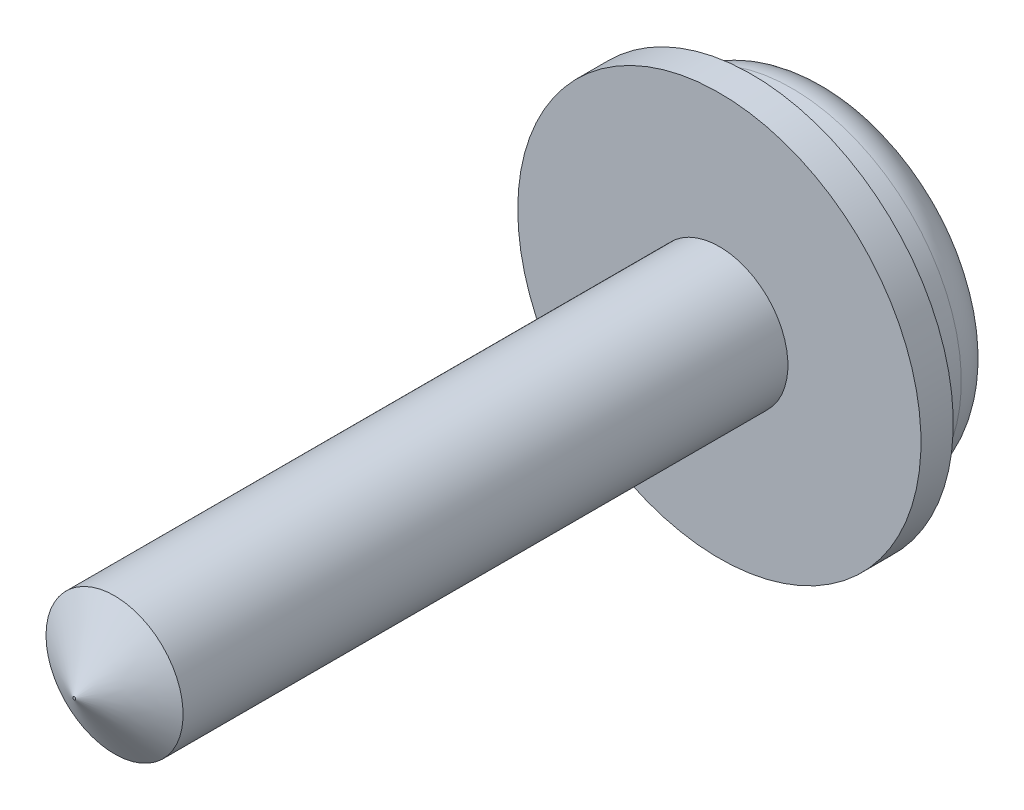
ISO-10303-21;
HEADER;
FILE_DESCRIPTION(('STEP AP214'),'2;1');
FILE_NAME('part.step','',(''),(''),'','','');
FILE_SCHEMA(('AUTOMOTIVE_DESIGN { 1 0 10303 214 1 1 1 1 }'));
ENDSEC;
DATA;
#1=APPLICATION_CONTEXT('core data for automotive mechanical design processes');
#2=APPLICATION_PROTOCOL_DEFINITION('international standard','automotive_design',2000,#1);
#3=PRODUCT_CONTEXT('',#1,'mechanical');
#4=PRODUCT('Part','Part','',(#3));
#5=PRODUCT_RELATED_PRODUCT_CATEGORY('part','',(#4));
#6=PRODUCT_DEFINITION_FORMATION('','',#4);
#7=PRODUCT_DEFINITION_CONTEXT('part definition',#1,'design');
#8=PRODUCT_DEFINITION('design','',#6,#7);
#9=PRODUCT_DEFINITION_SHAPE('','',#8);
#10=(LENGTH_UNIT() NAMED_UNIT(*) SI_UNIT(.MILLI.,.METRE.));
#11=(NAMED_UNIT(*) PLANE_ANGLE_UNIT() SI_UNIT($,.RADIAN.));
#12=(NAMED_UNIT(*) SI_UNIT($,.STERADIAN.) SOLID_ANGLE_UNIT());
#13=UNCERTAINTY_MEASURE_WITH_UNIT(LENGTH_MEASURE(1.E-05),#10,'distance_accuracy_value','');
#14=(GEOMETRIC_REPRESENTATION_CONTEXT(3) GLOBAL_UNCERTAINTY_ASSIGNED_CONTEXT((#13)) GLOBAL_UNIT_ASSIGNED_CONTEXT((#10,
#11,#12)) REPRESENTATION_CONTEXT('',''));
#15=CARTESIAN_POINT('',(0.,0.,0.));
#16=DIRECTION('',(0.,0.,1.));
#17=DIRECTION('',(1.,0.,0.));
#18=AXIS2_PLACEMENT_3D('',#15,#16,#17);
#19=CARTESIAN_POINT('',(0.,0.,-1.4));
#20=DIRECTION('',(0.,0.,-1.));
#21=DIRECTION('',(-1.,0.,0.));
#22=AXIS2_PLACEMENT_3D('',#19,#20,#21);
#23=PLANE('',#22);
#24=CARTESIAN_POINT('',(0.,0.,-1.4));
#25=DIRECTION('',(0.,0.,-1.));
#26=DIRECTION('',(-1.,0.,0.));
#27=AXIS2_PLACEMENT_3D('',#24,#25,#26);
#28=CIRCLE('',#27,1.6);
#29=CARTESIAN_POINT('',(-1.6,0.,-1.4));
#30=VERTEX_POINT('',#29);
#31=EDGE_CURVE('E43',#30,#30,#28,.T.);
#32=ORIENTED_EDGE('',*,*,#31,.T.);
#33=EDGE_LOOP('',(#32));
#34=FACE_BOUND('',#33,.T.);
#35=DIRECTION('',(0.,-1.,0.));
#36=VECTOR('',#35,1.);
#37=CARTESIAN_POINT('',(0.3,0.600000000000002,-1.4));
#38=LINE('',#37,#36);
#39=CARTESIAN_POINT('',(0.3,1.15,-1.4));
#40=VERTEX_POINT('',#39);
#41=CARTESIAN_POINT('',(0.3,0.6,-1.4));
#42=VERTEX_POINT('',#41);
#43=EDGE_CURVE('E50',#40,#42,#38,.T.);
#44=ORIENTED_EDGE('',*,*,#43,.F.);
#45=DIRECTION('',(1.,0.,0.));
#46=VECTOR('',#45,1.);
#47=CARTESIAN_POINT('',(-0.3,1.15,-1.4));
#48=LINE('',#47,#46);
#49=CARTESIAN_POINT('',(-0.3,1.15,-1.4));
#50=VERTEX_POINT('',#49);
#51=EDGE_CURVE('E223',#50,#40,#48,.T.);
#52=ORIENTED_EDGE('',*,*,#51,.F.);
#53=DIRECTION('',(0.,1.,0.));
#54=VECTOR('',#53,1.);
#55=CARTESIAN_POINT('',(-0.3,0.600000000000002,-1.4));
#56=LINE('',#55,#54);
#57=CARTESIAN_POINT('',(-0.3,0.600000000000002,-1.4));
#58=VERTEX_POINT('',#57);
#59=EDGE_CURVE('E221',#58,#50,#56,.T.);
#60=ORIENTED_EDGE('',*,*,#59,.F.);
#61=CARTESIAN_POINT('',(-0.6,0.6,-1.4));
#62=DIRECTION('',(0.,0.,1.));
#63=DIRECTION('',(-1.,0.,0.));
#64=AXIS2_PLACEMENT_3D('',#61,#62,#63);
#65=CIRCLE('',#64,0.3);
#66=CARTESIAN_POINT('',(-0.600000000000002,0.3,-1.4));
#67=VERTEX_POINT('',#66);
#68=EDGE_CURVE('E158',#67,#58,#65,.T.);
#69=ORIENTED_EDGE('',*,*,#68,.F.);
#70=DIRECTION('',(1.,0.,0.));
#71=VECTOR('',#70,1.);
#72=CARTESIAN_POINT('',(-1.15,0.3,-1.4));
#73=LINE('',#72,#71);
#74=CARTESIAN_POINT('',(-1.15,0.3,-1.4));
#75=VERTEX_POINT('',#74);
#76=EDGE_CURVE('E217',#75,#67,#73,.T.);
#77=ORIENTED_EDGE('',*,*,#76,.F.);
#78=DIRECTION('',(0.,1.,0.));
#79=VECTOR('',#78,1.);
#80=CARTESIAN_POINT('',(-1.15,-0.3,-1.4));
#81=LINE('',#80,#79);
#82=CARTESIAN_POINT('',(-1.15,-0.3,-1.4));
#83=VERTEX_POINT('',#82);
#84=EDGE_CURVE('E214',#83,#75,#81,.T.);
#85=ORIENTED_EDGE('',*,*,#84,.F.);
#86=DIRECTION('',(-1.,0.,0.));
#87=VECTOR('',#86,1.);
#88=CARTESIAN_POINT('',(-1.15,-0.3,-1.4));
#89=LINE('',#88,#87);
#90=CARTESIAN_POINT('',(-0.600000000000002,-0.3,-1.4));
#91=VERTEX_POINT('',#90);
#92=EDGE_CURVE('E211',#91,#83,#89,.T.);
#93=ORIENTED_EDGE('',*,*,#92,.F.);
#94=CARTESIAN_POINT('',(-0.6,-0.6,-1.4));
#95=DIRECTION('',(0.,0.,1.));
#96=DIRECTION('',(1.,0.,0.));
#97=AXIS2_PLACEMENT_3D('',#94,#95,#96);
#98=CIRCLE('',#97,0.3);
#99=CARTESIAN_POINT('',(-0.3,-0.600000000000002,-1.4));
#100=VERTEX_POINT('',#99);
#101=EDGE_CURVE('E208',#100,#91,#98,.T.);
#102=ORIENTED_EDGE('',*,*,#101,.F.);
#103=DIRECTION('',(0.,1.,0.));
#104=VECTOR('',#103,1.);
#105=CARTESIAN_POINT('',(-0.3,-1.15,-1.4));
#106=LINE('',#105,#104);
#107=CARTESIAN_POINT('',(-0.3,-1.15,-1.4));
#108=VERTEX_POINT('',#107);
#109=EDGE_CURVE('E205',#108,#100,#106,.T.);
#110=ORIENTED_EDGE('',*,*,#109,.F.);
#111=DIRECTION('',(-1.,0.,0.));
#112=VECTOR('',#111,1.);
#113=CARTESIAN_POINT('',(-0.3,-1.15,-1.4));
#114=LINE('',#113,#112);
#115=CARTESIAN_POINT('',(0.3,-1.15,-1.4));
#116=VERTEX_POINT('',#115);
#117=EDGE_CURVE('E202',#116,#108,#114,.T.);
#118=ORIENTED_EDGE('',*,*,#117,.F.);
#119=DIRECTION('',(0.,-1.,0.));
#120=VECTOR('',#119,1.);
#121=CARTESIAN_POINT('',(0.3,-1.15,-1.4));
#122=LINE('',#121,#120);
#123=CARTESIAN_POINT('',(0.3,-0.600000000000002,-1.4));
#124=VERTEX_POINT('',#123);
#125=EDGE_CURVE('E199',#124,#116,#122,.T.);
#126=ORIENTED_EDGE('',*,*,#125,.F.);
#127=CARTESIAN_POINT('',(0.6,-0.6,-1.4));
#128=DIRECTION('',(0.,0.,1.));
#129=DIRECTION('',(1.,0.,0.));
#130=AXIS2_PLACEMENT_3D('',#127,#128,#129);
#131=CIRCLE('',#130,0.3);
#132=CARTESIAN_POINT('',(0.600000000000002,-0.3,-1.4));
#133=VERTEX_POINT('',#132);
#134=EDGE_CURVE('E196',#133,#124,#131,.T.);
#135=ORIENTED_EDGE('',*,*,#134,.F.);
#136=DIRECTION('',(-1.,0.,0.));
#137=VECTOR('',#136,1.);
#138=CARTESIAN_POINT('',(0.600000000000002,-0.3,-1.4));
#139=LINE('',#138,#137);
#140=CARTESIAN_POINT('',(1.15,-0.3,-1.4));
#141=VERTEX_POINT('',#140);
#142=EDGE_CURVE('E193',#141,#133,#139,.T.);
#143=ORIENTED_EDGE('',*,*,#142,.F.);
#144=DIRECTION('',(0.,-1.,0.));
#145=VECTOR('',#144,1.);
#146=CARTESIAN_POINT('',(1.15,-0.3,-1.4));
#147=LINE('',#146,#145);
#148=CARTESIAN_POINT('',(1.15,0.3,-1.4));
#149=VERTEX_POINT('',#148);
#150=EDGE_CURVE('E190',#149,#141,#147,.T.);
#151=ORIENTED_EDGE('',*,*,#150,.F.);
#152=DIRECTION('',(1.,0.,0.));
#153=VECTOR('',#152,1.);
#154=CARTESIAN_POINT('',(0.600000000000002,0.3,-1.4));
#155=LINE('',#154,#153);
#156=CARTESIAN_POINT('',(0.600000000000002,0.3,-1.4));
#157=VERTEX_POINT('',#156);
#158=EDGE_CURVE('E187',#157,#149,#155,.T.);
#159=ORIENTED_EDGE('',*,*,#158,.F.);
#160=CARTESIAN_POINT('',(0.6,0.6,-1.4));
#161=DIRECTION('',(0.,0.,1.));
#162=DIRECTION('',(-1.,0.,0.));
#163=AXIS2_PLACEMENT_3D('',#160,#161,#162);
#164=CIRCLE('',#163,0.3);
#165=EDGE_CURVE('E184',#42,#157,#164,.T.);
#166=ORIENTED_EDGE('',*,*,#165,.F.);
#167=EDGE_LOOP('',(#44,#52,#60,#69,#77,#85,#93,#102,#110,#118,#126,#135,#143,#151,#159,#166));
#168=FACE_BOUND('',#167,.T.);
#169=ADVANCED_FACE('F35',(#34,#168),#23,.T.);
#170=CARTESIAN_POINT('',(0.,0.,8.));
#171=DIRECTION('',(0.,0.,-1.));
#172=DIRECTION('',(-1.,0.,0.));
#173=AXIS2_PLACEMENT_3D('',#170,#171,#172);
#174=CYLINDRICAL_SURFACE('',#173,0.85);
#175=CARTESIAN_POINT('',(0.,0.,7.5));
#176=DIRECTION('',(0.,0.,1.));
#177=DIRECTION('',(1.,0.,0.));
#178=AXIS2_PLACEMENT_3D('',#175,#176,#177);
#179=CIRCLE('',#178,0.85);
#180=CARTESIAN_POINT('',(-0.850000000000001,0.,7.5));
#181=VERTEX_POINT('',#180);
#182=EDGE_CURVE('E267',#181,#181,#179,.F.);
#183=ORIENTED_EDGE('',*,*,#182,.T.);
#184=EDGE_LOOP('',(#183));
#185=FACE_BOUND('',#184,.T.);
#186=CARTESIAN_POINT('',(0.,0.,0.));
#187=DIRECTION('',(0.,0.,-1.));
#188=DIRECTION('',(-1.,0.,0.));
#189=AXIS2_PLACEMENT_3D('',#186,#187,#188);
#190=CIRCLE('',#189,0.85);
#191=CARTESIAN_POINT('',(-0.85,0.,0.));
#192=VERTEX_POINT('',#191);
#193=EDGE_CURVE('E259',#192,#192,#190,.T.);
#194=ORIENTED_EDGE('',*,*,#193,.F.);
#195=EDGE_LOOP('',(#194));
#196=FACE_BOUND('',#195,.T.);
#197=ADVANCED_FACE('F289',(#185,#196),#174,.T.);
#198=CARTESIAN_POINT('',(0.,0.,8.));
#199=DIRECTION('',(0.,0.,1.));
#200=DIRECTION('',(1.,0.,0.));
#201=AXIS2_PLACEMENT_3D('',#198,#199,#200);
#202=PLANE('',#201);
#203=CARTESIAN_POINT('',(0.,0.,8.));
#204=DIRECTION('',(0.,0.,1.));
#205=DIRECTION('',(1.,0.,0.));
#206=AXIS2_PLACEMENT_3D('',#203,#204,#205);
#207=CIRCLE('',#206,0.0178602588247409);
#208=CARTESIAN_POINT('',(-0.0178602588247423,0.,8.));
#209=VERTEX_POINT('',#208);
#210=EDGE_CURVE('E264',#209,#209,#207,.T.);
#211=ORIENTED_EDGE('',*,*,#210,.T.);
#212=EDGE_LOOP('',(#211));
#213=FACE_BOUND('',#212,.T.);
#214=ADVANCED_FACE('F294',(#213),#202,.T.);
#215=CARTESIAN_POINT('',(0.,0.,8.));
#216=DIRECTION('',(0.,0.,-1.));
#217=DIRECTION('',(-1.,0.,0.));
#218=AXIS2_PLACEMENT_3D('',#215,#216,#217);
#219=CONICAL_SURFACE('',#218,0.0178602588247409,1.02974425867665);
#220=CARTESIAN_POINT('',(-0.850000000000001,0.,7.5));
#221=CARTESIAN_POINT('',(-0.841331877696092,0.,7.50520833333333));
#222=CARTESIAN_POINT('',(-0.832663755392183,0.,7.51041666666666));
#223=CARTESIAN_POINT('',(-0.815327510784365,0.,7.52083333333333));
#224=CARTESIAN_POINT('',(-0.806659388480456,0.,7.52604166666666));
#225=CARTESIAN_POINT('',(-0.789323143872638,0.,7.53645833333333));
#226=CARTESIAN_POINT('',(-0.780655021568729,0.,7.54166666666666));
#227=CARTESIAN_POINT('',(-0.763318776960911,0.,7.55208333333333));
#228=CARTESIAN_POINT('',(-0.754650654657002,0.,7.55729166666666));
#229=CARTESIAN_POINT('',(-0.737314410049185,0.,7.56770833333333));
#230=CARTESIAN_POINT('',(-0.728646287745276,0.,7.57291666666666));
#231=CARTESIAN_POINT('',(-0.711310043137458,0.,7.58333333333333));
#232=CARTESIAN_POINT('',(-0.702641920833549,0.,7.58854166666666));
#233=CARTESIAN_POINT('',(-0.685305676225731,0.,7.59895833333333));
#234=CARTESIAN_POINT('',(-0.676637553921822,0.,7.60416666666666));
#235=CARTESIAN_POINT('',(-0.659301309314004,0.,7.61458333333333));
#236=CARTESIAN_POINT('',(-0.650633187010095,0.,7.61979166666666));
#237=CARTESIAN_POINT('',(-0.633296942402277,0.,7.63020833333333));
#238=CARTESIAN_POINT('',(-0.624628820098368,0.,7.63541666666666));
#239=CARTESIAN_POINT('',(-0.60729257549055,0.,7.64583333333333));
#240=CARTESIAN_POINT('',(-0.598624453186641,0.,7.65104166666666));
#241=CARTESIAN_POINT('',(-0.581288208578824,0.,7.66145833333333));
#242=CARTESIAN_POINT('',(-0.572620086274915,0.,7.66666666666666));
#243=CARTESIAN_POINT('',(-0.555283841667097,0.,7.67708333333333));
#244=CARTESIAN_POINT('',(-0.546615719363188,0.,7.68229166666666));
#245=CARTESIAN_POINT('',(-0.52927947475537,0.,7.69270833333333));
#246=CARTESIAN_POINT('',(-0.520611352451461,0.,7.69791666666666));
#247=CARTESIAN_POINT('',(-0.503275107843643,0.,7.70833333333333));
#248=CARTESIAN_POINT('',(-0.494606985539734,0.,7.71354166666666));
#249=CARTESIAN_POINT('',(-0.477270740931916,0.,7.72395833333333));
#250=CARTESIAN_POINT('',(-0.468602618628007,0.,7.72916666666666));
#251=CARTESIAN_POINT('',(-0.451266374020189,0.,7.73958333333333));
#252=CARTESIAN_POINT('',(-0.442598251716281,0.,7.74479166666666));
#253=CARTESIAN_POINT('',(-0.425262007108463,0.,7.75520833333333));
#254=CARTESIAN_POINT('',(-0.416593884804554,0.,7.76041666666666));
#255=CARTESIAN_POINT('',(-0.399257640196736,0.,7.77083333333333));
#256=CARTESIAN_POINT('',(-0.390589517892827,0.,7.77604166666666));
#257=CARTESIAN_POINT('',(-0.373253273285009,0.,7.78645833333333));
#258=CARTESIAN_POINT('',(-0.3645851509811,0.,7.79166666666666));
#259=CARTESIAN_POINT('',(-0.347248906373282,0.,7.80208333333333));
#260=CARTESIAN_POINT('',(-0.338580784069373,0.,7.80729166666666));
#261=CARTESIAN_POINT('',(-0.321244539461555,0.,7.81770833333333));
#262=CARTESIAN_POINT('',(-0.312576417157646,0.,7.82291666666667));
#263=CARTESIAN_POINT('',(-0.295240172549829,0.,7.83333333333333));
#264=CARTESIAN_POINT('',(-0.28657205024592,0.,7.83854166666667));
#265=CARTESIAN_POINT('',(-0.269235805638102,0.,7.84895833333333));
#266=CARTESIAN_POINT('',(-0.260567683334193,0.,7.85416666666667));
#267=CARTESIAN_POINT('',(-0.243231438726375,0.,7.86458333333333));
#268=CARTESIAN_POINT('',(-0.234563316422466,0.,7.86979166666667));
#269=CARTESIAN_POINT('',(-0.217227071814648,0.,7.88020833333333));
#270=CARTESIAN_POINT('',(-0.208558949510739,0.,7.88541666666667));
#271=CARTESIAN_POINT('',(-0.191222704902921,0.,7.89583333333333));
#272=CARTESIAN_POINT('',(-0.182554582599012,0.,7.90104166666667));
#273=CARTESIAN_POINT('',(-0.165218337991194,0.,7.91145833333333));
#274=CARTESIAN_POINT('',(-0.156550215687285,0.,7.91666666666667));
#275=CARTESIAN_POINT('',(-0.139213971079468,0.,7.92708333333333));
#276=CARTESIAN_POINT('',(-0.130545848775559,0.,7.93229166666667));
#277=CARTESIAN_POINT('',(-0.113209604167741,0.,7.94270833333333));
#278=CARTESIAN_POINT('',(-0.104541481863832,0.,7.94791666666667));
#279=CARTESIAN_POINT('',(-0.0872052372560139,0.,7.95833333333333));
#280=CARTESIAN_POINT('',(-0.078537114952105,0.,7.96354166666667));
#281=CARTESIAN_POINT('',(-0.0612008703442871,0.,7.97395833333333));
#282=CARTESIAN_POINT('',(-0.0525327480403781,0.,7.97916666666667));
#283=CARTESIAN_POINT('',(-0.0351965034325601,0.,7.98958333333333));
#284=CARTESIAN_POINT('',(-0.0265283811286511,0.,7.99479166666667));
#285=CARTESIAN_POINT('',(-0.0178602588247423,0.,8.));
#286=B_SPLINE_CURVE_WITH_KNOTS('',3,(#220,#221,#222,#223,#224,#225,#226,#227,#228,#229,#230,
#231,#232,#233,#234,#235,#236,#237,#238,#239,#240,#241,#242,#243,#244,#245,#246,#247,#248,#249,
#250,#251,#252,#253,#254,#255,#256,#257,#258,#259,#260,#261,#262,#263,#264,#265,#266,#267,#268,
#269,#270,#271,#272,#273,#274,#275,#276,#277,#278,#279,#280,#281,#282,#283,#284,#285),
.UNSPECIFIED.,.F.,.F.,(4,2,2,2,2,2,2,2,2,2,2,2,2,2,2,2,2,2,2,2,2,2,2,2,2,2,2,2,2,2,2,2,4),(0.,
0.0303375629126618,0.0606751258253237,0.0910126887379854,0.121350251650647,0.151687814563309,
0.182025377475971,0.212362940388633,0.242700503301294,0.273038066213956,0.303375629126619,
0.33371319203928,0.364050754951942,0.394388317864604,0.424725880777266,0.455063443689928,
0.485401006602589,0.515738569515251,0.546076132427914,0.576413695340575,0.606751258253237,
0.637088821165899,0.667426384078561,0.697763946991223,0.728101509903885,0.758439072816546,
0.788776635729208,0.81911419864187,0.849451761554532,0.879789324467194,0.910126887379856,
0.940464450292517,0.97080201320518),.UNSPECIFIED.);
#287=EDGE_CURVE('BSEAM309',#181,#209,#286,.T.);
#288=ORIENTED_EDGE('',*,*,#182,.F.);
#289=ORIENTED_EDGE('',*,*,#210,.F.);
#290=ORIENTED_EDGE('',*,*,#287,.T.);
#291=ORIENTED_EDGE('',*,*,#287,.F.);
#292=EDGE_LOOP('',(#288,#290,#289,#291));
#293=FACE_BOUND('',#292,.T.);
#294=ADVANCED_FACE('F309',(#293),#219,.T.);
#295=CARTESIAN_POINT('',(0.,0.,-0.4));
#296=DIRECTION('',(0.,0.,1.));
#297=DIRECTION('',(1.,0.,0.));
#298=AXIS2_PLACEMENT_3D('',#295,#296,#297);
#299=CYLINDRICAL_SURFACE('',#298,2.5);
#300=CARTESIAN_POINT('',(0.,0.,-0.4));
#301=DIRECTION('',(0.,0.,-1.));
#302=DIRECTION('',(-1.,0.,0.));
#303=AXIS2_PLACEMENT_3D('',#300,#301,#302);
#304=CIRCLE('',#303,2.5);
#305=CARTESIAN_POINT('',(-2.5,0.,-0.4));
#306=VERTEX_POINT('',#305);
#307=EDGE_CURVE('E256',#306,#306,#304,.T.);
#308=ORIENTED_EDGE('',*,*,#307,.F.);
#309=EDGE_LOOP('',(#308));
#310=FACE_BOUND('',#309,.T.);
#311=CARTESIAN_POINT('',(0.,0.,0.));
#312=DIRECTION('',(0.,0.,-1.));
#313=DIRECTION('',(-1.,0.,0.));
#314=AXIS2_PLACEMENT_3D('',#311,#312,#313);
#315=CIRCLE('',#314,2.5);
#316=CARTESIAN_POINT('',(-2.5,0.,0.));
#317=VERTEX_POINT('',#316);
#318=EDGE_CURVE('E255',#317,#317,#315,.T.);
#319=ORIENTED_EDGE('',*,*,#318,.T.);
#320=EDGE_LOOP('',(#319));
#321=FACE_BOUND('',#320,.T.);
#322=ADVANCED_FACE('F302',(#310,#321),#299,.T.);
#323=CARTESIAN_POINT('',(0.,0.,-0.4));
#324=DIRECTION('',(0.,0.,-1.));
#325=DIRECTION('',(-1.,0.,0.));
#326=AXIS2_PLACEMENT_3D('',#323,#324,#325);
#327=PLANE('',#326);
#328=CARTESIAN_POINT('',(0.,0.,-0.4));
#329=DIRECTION('',(0.,0.,-1.));
#330=DIRECTION('',(-1.,0.,0.));
#331=AXIS2_PLACEMENT_3D('',#328,#329,#330);
#332=CIRCLE('',#331,2.1);
#333=CARTESIAN_POINT('',(-2.1,0.,-0.4));
#334=VERTEX_POINT('',#333);
#335=EDGE_CURVE('E227',#334,#334,#332,.T.);
#336=ORIENTED_EDGE('',*,*,#335,.F.);
#337=EDGE_LOOP('',(#336));
#338=FACE_BOUND('',#337,.T.);
#339=ORIENTED_EDGE('',*,*,#307,.T.);
#340=EDGE_LOOP('',(#339));
#341=FACE_BOUND('',#340,.T.);
#342=ADVANCED_FACE('F299',(#338,#341),#327,.T.);
#343=CARTESIAN_POINT('',(0.,0.,0.));
#344=DIRECTION('',(0.,0.,-1.));
#345=DIRECTION('',(-1.,0.,0.));
#346=AXIS2_PLACEMENT_3D('',#343,#344,#345);
#347=PLANE('',#346);
#348=ORIENTED_EDGE('',*,*,#193,.T.);
#349=EDGE_LOOP('',(#348));
#350=FACE_BOUND('',#349,.T.);
#351=ORIENTED_EDGE('',*,*,#318,.F.);
#352=EDGE_LOOP('',(#351));
#353=FACE_BOUND('',#352,.T.);
#354=ADVANCED_FACE('F284',(#350,#353),#347,.F.);
#355=CARTESIAN_POINT('',(0.,0.,-1.4));
#356=DIRECTION('',(0.,0.,1.));
#357=DIRECTION('',(1.,0.,0.));
#358=AXIS2_PLACEMENT_3D('',#355,#356,#357);
#359=CYLINDRICAL_SURFACE('',#358,2.1);
#360=CARTESIAN_POINT('',(0.,0.,-0.9));
#361=DIRECTION('',(0.,0.,-1.));
#362=DIRECTION('',(-1.,0.,0.));
#363=AXIS2_PLACEMENT_3D('',#360,#361,#362);
#364=CIRCLE('',#363,2.1);
#365=CARTESIAN_POINT('',(-2.1,0.,-0.9));
#366=VERTEX_POINT('',#365);
#367=EDGE_CURVE('E11',#366,#366,#364,.F.);
#368=ORIENTED_EDGE('',*,*,#367,.T.);
#369=EDGE_LOOP('',(#368));
#370=FACE_BOUND('',#369,.T.);
#371=ORIENTED_EDGE('',*,*,#335,.T.);
#372=EDGE_LOOP('',(#371));
#373=FACE_BOUND('',#372,.T.);
#374=ADVANCED_FACE('F276',(#370,#373),#359,.T.);
#375=CARTESIAN_POINT('',(0.,0.,-0.9));
#376=DIRECTION('',(0.,0.,-1.));
#377=DIRECTION('',(-1.,0.,0.));
#378=AXIS2_PLACEMENT_3D('',#375,#376,#377);
#379=TOROIDAL_SURFACE('',#378,1.6,0.5);
#380=ORIENTED_EDGE('',*,*,#367,.F.);
#381=EDGE_LOOP('',(#380));
#382=FACE_BOUND('',#381,.T.);
#383=ORIENTED_EDGE('',*,*,#31,.F.);
#384=EDGE_LOOP('',(#383));
#385=FACE_BOUND('',#384,.T.);
#386=ADVANCED_FACE('F37',(#382,#385),#379,.T.);
#387=CARTESIAN_POINT('',(0.3,0.600000000000002,-0.4));
#388=DIRECTION('',(1.,0.,0.));
#389=DIRECTION('',(0.,1.,0.));
#390=AXIS2_PLACEMENT_3D('',#387,#388,#389);
#391=PLANE('',#390);
#392=ORIENTED_EDGE('',*,*,#43,.T.);
#393=DIRECTION('',(0.,0.,-1.));
#394=VECTOR('',#393,1.);
#395=CARTESIAN_POINT('',(0.3,0.6,-0.4));
#396=LINE('',#395,#394);
#397=CARTESIAN_POINT('',(0.3,0.6,-0.4));
#398=VERTEX_POINT('',#397);
#399=EDGE_CURVE('E110',#398,#42,#396,.T.);
#400=ORIENTED_EDGE('',*,*,#399,.F.);
#401=DIRECTION('',(0.,-1.,0.));
#402=VECTOR('',#401,1.);
#403=CARTESIAN_POINT('',(0.3,0.600000000000002,-0.4));
#404=LINE('',#403,#402);
#405=CARTESIAN_POINT('',(0.3,1.15,-0.4));
#406=VERTEX_POINT('',#405);
#407=EDGE_CURVE('E225',#406,#398,#404,.T.);
#408=ORIENTED_EDGE('',*,*,#407,.F.);
#409=DIRECTION('',(0.,0.,-1.));
#410=VECTOR('',#409,1.);
#411=CARTESIAN_POINT('',(0.3,1.15,-0.4));
#412=LINE('',#411,#410);
#413=EDGE_CURVE('E58',#406,#40,#412,.T.);
#414=ORIENTED_EDGE('',*,*,#413,.T.);
#415=EDGE_LOOP('',(#392,#400,#408,#414));
#416=FACE_BOUND('',#415,.T.);
#417=ADVANCED_FACE('F275',(#416),#391,.F.);
#418=CARTESIAN_POINT('',(-0.3,1.15,-0.4));
#419=DIRECTION('',(0.,1.,0.));
#420=DIRECTION('',(0.,0.,1.));
#421=AXIS2_PLACEMENT_3D('',#418,#419,#420);
#422=PLANE('',#421);
#423=ORIENTED_EDGE('',*,*,#51,.T.);
#424=ORIENTED_EDGE('',*,*,#413,.F.);
#425=DIRECTION('',(1.,0.,0.));
#426=VECTOR('',#425,1.);
#427=CARTESIAN_POINT('',(-0.3,1.15,-0.4));
#428=LINE('',#427,#426);
#429=CARTESIAN_POINT('',(-0.3,1.15,-0.4));
#430=VERTEX_POINT('',#429);
#431=EDGE_CURVE('E170',#430,#406,#428,.T.);
#432=ORIENTED_EDGE('',*,*,#431,.F.);
#433=DIRECTION('',(0.,0.,-1.));
#434=VECTOR('',#433,1.);
#435=CARTESIAN_POINT('',(-0.3,1.15,-0.4));
#436=LINE('',#435,#434);
#437=EDGE_CURVE('E162',#430,#50,#436,.T.);
#438=ORIENTED_EDGE('',*,*,#437,.T.);
#439=EDGE_LOOP('',(#423,#424,#432,#438));
#440=FACE_BOUND('',#439,.T.);
#441=ADVANCED_FACE('F282',(#440),#422,.F.);
#442=CARTESIAN_POINT('',(-0.3,0.600000000000002,-0.4));
#443=DIRECTION('',(-1.,0.,0.));
#444=DIRECTION('',(0.,0.,1.));
#445=AXIS2_PLACEMENT_3D('',#442,#443,#444);
#446=PLANE('',#445);
#447=ORIENTED_EDGE('',*,*,#59,.T.);
#448=ORIENTED_EDGE('',*,*,#437,.F.);
#449=DIRECTION('',(0.,1.,0.));
#450=VECTOR('',#449,1.);
#451=CARTESIAN_POINT('',(-0.3,0.600000000000002,-0.4));
#452=LINE('',#451,#450);
#453=CARTESIAN_POINT('',(-0.3,0.600000000000002,-0.4));
#454=VERTEX_POINT('',#453);
#455=EDGE_CURVE('E166',#454,#430,#452,.T.);
#456=ORIENTED_EDGE('',*,*,#455,.F.);
#457=DIRECTION('',(0.,0.,-1.));
#458=VECTOR('',#457,1.);
#459=CARTESIAN_POINT('',(-0.3,0.600000000000002,-0.4));
#460=LINE('',#459,#458);
#461=EDGE_CURVE('E151',#454,#58,#460,.T.);
#462=ORIENTED_EDGE('',*,*,#461,.T.);
#463=EDGE_LOOP('',(#447,#448,#456,#462));
#464=FACE_BOUND('',#463,.T.);
#465=ADVANCED_FACE('F167',(#464),#446,.F.);
#466=CARTESIAN_POINT('',(-0.6,0.6,-0.4));
#467=DIRECTION('',(0.,0.,-1.));
#468=DIRECTION('',(-1.,0.,0.));
#469=AXIS2_PLACEMENT_3D('',#466,#467,#468);
#470=CYLINDRICAL_SURFACE('',#469,0.3);
#471=ORIENTED_EDGE('',*,*,#68,.T.);
#472=ORIENTED_EDGE('',*,*,#461,.F.);
#473=CARTESIAN_POINT('',(-0.6,0.6,-0.4));
#474=DIRECTION('',(0.,0.,1.));
#475=DIRECTION('',(-1.,0.,0.));
#476=AXIS2_PLACEMENT_3D('',#473,#474,#475);
#477=CIRCLE('',#476,0.3);
#478=CARTESIAN_POINT('',(-0.600000000000002,0.3,-0.4));
#479=VERTEX_POINT('',#478);
#480=EDGE_CURVE('E155',#479,#454,#477,.T.);
#481=ORIENTED_EDGE('',*,*,#480,.F.);
#482=DIRECTION('',(0.,0.,-1.));
#483=VECTOR('',#482,1.);
#484=CARTESIAN_POINT('',(-0.600000000000002,0.3,-0.4));
#485=LINE('',#484,#483);
#486=EDGE_CURVE('E163',#479,#67,#485,.T.);
#487=ORIENTED_EDGE('',*,*,#486,.T.);
#488=EDGE_LOOP('',(#471,#472,#481,#487));
#489=FACE_BOUND('',#488,.T.);
#490=ADVANCED_FACE('F153',(#489),#470,.T.);
#491=CARTESIAN_POINT('',(-1.15,0.3,-0.4));
#492=DIRECTION('',(0.,1.,0.));
#493=DIRECTION('',(-1.,0.,0.));
#494=AXIS2_PLACEMENT_3D('',#491,#492,#493);
#495=PLANE('',#494);
#496=ORIENTED_EDGE('',*,*,#76,.T.);
#497=ORIENTED_EDGE('',*,*,#486,.F.);
#498=DIRECTION('',(1.,0.,0.));
#499=VECTOR('',#498,1.);
#500=CARTESIAN_POINT('',(-1.15,0.3,-0.4));
#501=LINE('',#500,#499);
#502=CARTESIAN_POINT('',(-1.15,0.3,-0.4));
#503=VERTEX_POINT('',#502);
#504=EDGE_CURVE('E176',#503,#479,#501,.T.);
#505=ORIENTED_EDGE('',*,*,#504,.F.);
#506=DIRECTION('',(0.,0.,-1.));
#507=VECTOR('',#506,1.);
#508=CARTESIAN_POINT('',(-1.15,0.3,-0.4));
#509=LINE('',#508,#507);
#510=EDGE_CURVE('E230',#503,#75,#509,.T.);
#511=ORIENTED_EDGE('',*,*,#510,.T.);
#512=EDGE_LOOP('',(#496,#497,#505,#511));
#513=FACE_BOUND('',#512,.T.);
#514=ADVANCED_FACE('F382',(#513),#495,.F.);
#515=CARTESIAN_POINT('',(-1.15,-0.3,-0.4));
#516=DIRECTION('',(-1.,0.,0.));
#517=DIRECTION('',(0.,0.,1.));
#518=AXIS2_PLACEMENT_3D('',#515,#516,#517);
#519=PLANE('',#518);
#520=ORIENTED_EDGE('',*,*,#84,.T.);
#521=ORIENTED_EDGE('',*,*,#510,.F.);
#522=DIRECTION('',(0.,1.,0.));
#523=VECTOR('',#522,1.);
#524=CARTESIAN_POINT('',(-1.15,-0.3,-0.4));
#525=LINE('',#524,#523);
#526=CARTESIAN_POINT('',(-1.15,-0.3,-0.4));
#527=VERTEX_POINT('',#526);
#528=EDGE_CURVE('E178',#527,#503,#525,.T.);
#529=ORIENTED_EDGE('',*,*,#528,.F.);
#530=DIRECTION('',(0.,0.,-1.));
#531=VECTOR('',#530,1.);
#532=CARTESIAN_POINT('',(-1.15,-0.3,-0.4));
#533=LINE('',#532,#531);
#534=EDGE_CURVE('E232',#527,#83,#533,.T.);
#535=ORIENTED_EDGE('',*,*,#534,.T.);
#536=EDGE_LOOP('',(#520,#521,#529,#535));
#537=FACE_BOUND('',#536,.T.);
#538=ADVANCED_FACE('F391',(#537),#519,.F.);
#539=CARTESIAN_POINT('',(-1.15,-0.3,-0.4));
#540=DIRECTION('',(0.,-1.,0.));
#541=DIRECTION('',(1.,0.,0.));
#542=AXIS2_PLACEMENT_3D('',#539,#540,#541);
#543=PLANE('',#542);
#544=ORIENTED_EDGE('',*,*,#92,.T.);
#545=ORIENTED_EDGE('',*,*,#534,.F.);
#546=DIRECTION('',(-1.,0.,0.));
#547=VECTOR('',#546,1.);
#548=CARTESIAN_POINT('',(-1.15,-0.3,-0.4));
#549=LINE('',#548,#547);
#550=CARTESIAN_POINT('',(-0.600000000000002,-0.3,-0.4));
#551=VERTEX_POINT('',#550);
#552=EDGE_CURVE('E547',#551,#527,#549,.T.);
#553=ORIENTED_EDGE('',*,*,#552,.F.);
#554=DIRECTION('',(0.,0.,-1.));
#555=VECTOR('',#554,1.);
#556=CARTESIAN_POINT('',(-0.600000000000002,-0.3,-0.4));
#557=LINE('',#556,#555);
#558=EDGE_CURVE('E234',#551,#91,#557,.T.);
#559=ORIENTED_EDGE('',*,*,#558,.T.);
#560=EDGE_LOOP('',(#544,#545,#553,#559));
#561=FACE_BOUND('',#560,.T.);
#562=ADVANCED_FACE('F401',(#561),#543,.F.);
#563=CARTESIAN_POINT('',(-0.6,-0.6,-0.4));
#564=DIRECTION('',(0.,0.,-1.));
#565=DIRECTION('',(-1.,0.,0.));
#566=AXIS2_PLACEMENT_3D('',#563,#564,#565);
#567=CYLINDRICAL_SURFACE('',#566,0.3);
#568=ORIENTED_EDGE('',*,*,#101,.T.);
#569=ORIENTED_EDGE('',*,*,#558,.F.);
#570=CARTESIAN_POINT('',(-0.6,-0.6,-0.4));
#571=DIRECTION('',(0.,0.,1.));
#572=DIRECTION('',(1.,0.,0.));
#573=AXIS2_PLACEMENT_3D('',#570,#571,#572);
#574=CIRCLE('',#573,0.3);
#575=CARTESIAN_POINT('',(-0.3,-0.600000000000002,-0.4));
#576=VERTEX_POINT('',#575);
#577=EDGE_CURVE('E544',#576,#551,#574,.T.);
#578=ORIENTED_EDGE('',*,*,#577,.F.);
#579=DIRECTION('',(0.,0.,-1.));
#580=VECTOR('',#579,1.);
#581=CARTESIAN_POINT('',(-0.3,-0.600000000000002,-0.4));
#582=LINE('',#581,#580);
#583=EDGE_CURVE('E236',#576,#100,#582,.T.);
#584=ORIENTED_EDGE('',*,*,#583,.T.);
#585=EDGE_LOOP('',(#568,#569,#578,#584));
#586=FACE_BOUND('',#585,.T.);
#587=ADVANCED_FACE('F411',(#586),#567,.T.);
#588=CARTESIAN_POINT('',(-0.3,-1.15,-0.4));
#589=DIRECTION('',(-1.,0.,0.));
#590=DIRECTION('',(0.,0.,1.));
#591=AXIS2_PLACEMENT_3D('',#588,#589,#590);
#592=PLANE('',#591);
#593=ORIENTED_EDGE('',*,*,#109,.T.);
#594=ORIENTED_EDGE('',*,*,#583,.F.);
#595=DIRECTION('',(0.,1.,0.));
#596=VECTOR('',#595,1.);
#597=CARTESIAN_POINT('',(-0.3,-1.15,-0.4));
#598=LINE('',#597,#596);
#599=CARTESIAN_POINT('',(-0.3,-1.15,-0.4));
#600=VERTEX_POINT('',#599);
#601=EDGE_CURVE('E541',#600,#576,#598,.T.);
#602=ORIENTED_EDGE('',*,*,#601,.F.);
#603=DIRECTION('',(0.,0.,-1.));
#604=VECTOR('',#603,1.);
#605=CARTESIAN_POINT('',(-0.3,-1.15,-0.4));
#606=LINE('',#605,#604);
#607=EDGE_CURVE('E238',#600,#108,#606,.T.);
#608=ORIENTED_EDGE('',*,*,#607,.T.);
#609=EDGE_LOOP('',(#593,#594,#602,#608));
#610=FACE_BOUND('',#609,.T.);
#611=ADVANCED_FACE('F421',(#610),#592,.F.);
#612=CARTESIAN_POINT('',(-0.3,-1.15,-0.4));
#613=DIRECTION('',(0.,-1.,0.));
#614=DIRECTION('',(0.,0.,-1.));
#615=AXIS2_PLACEMENT_3D('',#612,#613,#614);
#616=PLANE('',#615);
#617=ORIENTED_EDGE('',*,*,#117,.T.);
#618=ORIENTED_EDGE('',*,*,#607,.F.);
#619=DIRECTION('',(-1.,0.,0.));
#620=VECTOR('',#619,1.);
#621=CARTESIAN_POINT('',(-0.3,-1.15,-0.4));
#622=LINE('',#621,#620);
#623=CARTESIAN_POINT('',(0.3,-1.15,-0.4));
#624=VERTEX_POINT('',#623);
#625=EDGE_CURVE('E538',#624,#600,#622,.T.);
#626=ORIENTED_EDGE('',*,*,#625,.F.);
#627=DIRECTION('',(0.,0.,-1.));
#628=VECTOR('',#627,1.);
#629=CARTESIAN_POINT('',(0.3,-1.15,-0.4));
#630=LINE('',#629,#628);
#631=EDGE_CURVE('E240',#624,#116,#630,.T.);
#632=ORIENTED_EDGE('',*,*,#631,.T.);
#633=EDGE_LOOP('',(#617,#618,#626,#632));
#634=FACE_BOUND('',#633,.T.);
#635=ADVANCED_FACE('F431',(#634),#616,.F.);
#636=CARTESIAN_POINT('',(0.3,-1.15,-0.4));
#637=DIRECTION('',(1.,0.,0.));
#638=DIRECTION('',(0.,0.,-1.));
#639=AXIS2_PLACEMENT_3D('',#636,#637,#638);
#640=PLANE('',#639);
#641=ORIENTED_EDGE('',*,*,#125,.T.);
#642=ORIENTED_EDGE('',*,*,#631,.F.);
#643=DIRECTION('',(0.,-1.,0.));
#644=VECTOR('',#643,1.);
#645=CARTESIAN_POINT('',(0.3,-1.15,-0.4));
#646=LINE('',#645,#644);
#647=CARTESIAN_POINT('',(0.3,-0.600000000000002,-0.4));
#648=VERTEX_POINT('',#647);
#649=EDGE_CURVE('E535',#648,#624,#646,.T.);
#650=ORIENTED_EDGE('',*,*,#649,.F.);
#651=DIRECTION('',(0.,0.,-1.));
#652=VECTOR('',#651,1.);
#653=CARTESIAN_POINT('',(0.3,-0.600000000000002,-0.4));
#654=LINE('',#653,#652);
#655=EDGE_CURVE('E242',#648,#124,#654,.T.);
#656=ORIENTED_EDGE('',*,*,#655,.T.);
#657=EDGE_LOOP('',(#641,#642,#650,#656));
#658=FACE_BOUND('',#657,.T.);
#659=ADVANCED_FACE('F441',(#658),#640,.F.);
#660=CARTESIAN_POINT('',(0.6,-0.6,-0.4));
#661=DIRECTION('',(0.,0.,-1.));
#662=DIRECTION('',(-1.,0.,0.));
#663=AXIS2_PLACEMENT_3D('',#660,#661,#662);
#664=CYLINDRICAL_SURFACE('',#663,0.3);
#665=ORIENTED_EDGE('',*,*,#134,.T.);
#666=ORIENTED_EDGE('',*,*,#655,.F.);
#667=CARTESIAN_POINT('',(0.6,-0.6,-0.4));
#668=DIRECTION('',(0.,0.,1.));
#669=DIRECTION('',(1.,0.,0.));
#670=AXIS2_PLACEMENT_3D('',#667,#668,#669);
#671=CIRCLE('',#670,0.3);
#672=CARTESIAN_POINT('',(0.600000000000002,-0.3,-0.4));
#673=VERTEX_POINT('',#672);
#674=EDGE_CURVE('E532',#673,#648,#671,.T.);
#675=ORIENTED_EDGE('',*,*,#674,.F.);
#676=DIRECTION('',(0.,0.,-1.));
#677=VECTOR('',#676,1.);
#678=CARTESIAN_POINT('',(0.600000000000002,-0.3,-0.4));
#679=LINE('',#678,#677);
#680=EDGE_CURVE('E244',#673,#133,#679,.T.);
#681=ORIENTED_EDGE('',*,*,#680,.T.);
#682=EDGE_LOOP('',(#665,#666,#675,#681));
#683=FACE_BOUND('',#682,.T.);
#684=ADVANCED_FACE('F451',(#683),#664,.T.);
#685=CARTESIAN_POINT('',(0.600000000000002,-0.3,-0.4));
#686=DIRECTION('',(0.,-1.,0.));
#687=DIRECTION('',(1.,0.,0.));
#688=AXIS2_PLACEMENT_3D('',#685,#686,#687);
#689=PLANE('',#688);
#690=ORIENTED_EDGE('',*,*,#142,.T.);
#691=ORIENTED_EDGE('',*,*,#680,.F.);
#692=DIRECTION('',(-1.,0.,0.));
#693=VECTOR('',#692,1.);
#694=CARTESIAN_POINT('',(0.600000000000002,-0.3,-0.4));
#695=LINE('',#694,#693);
#696=CARTESIAN_POINT('',(1.15,-0.3,-0.4));
#697=VERTEX_POINT('',#696);
#698=EDGE_CURVE('E529',#697,#673,#695,.T.);
#699=ORIENTED_EDGE('',*,*,#698,.F.);
#700=DIRECTION('',(0.,0.,-1.));
#701=VECTOR('',#700,1.);
#702=CARTESIAN_POINT('',(1.15,-0.3,-0.4));
#703=LINE('',#702,#701);
#704=EDGE_CURVE('E246',#697,#141,#703,.T.);
#705=ORIENTED_EDGE('',*,*,#704,.T.);
#706=EDGE_LOOP('',(#690,#691,#699,#705));
#707=FACE_BOUND('',#706,.T.);
#708=ADVANCED_FACE('F461',(#707),#689,.F.);
#709=CARTESIAN_POINT('',(1.15,-0.3,-0.4));
#710=DIRECTION('',(1.,0.,0.));
#711=DIRECTION('',(0.,0.,-1.));
#712=AXIS2_PLACEMENT_3D('',#709,#710,#711);
#713=PLANE('',#712);
#714=ORIENTED_EDGE('',*,*,#150,.T.);
#715=ORIENTED_EDGE('',*,*,#704,.F.);
#716=DIRECTION('',(0.,-1.,0.));
#717=VECTOR('',#716,1.);
#718=CARTESIAN_POINT('',(1.15,-0.3,-0.4));
#719=LINE('',#718,#717);
#720=CARTESIAN_POINT('',(1.15,0.3,-0.4));
#721=VERTEX_POINT('',#720);
#722=EDGE_CURVE('E522',#721,#697,#719,.T.);
#723=ORIENTED_EDGE('',*,*,#722,.F.);
#724=DIRECTION('',(0.,0.,-1.));
#725=VECTOR('',#724,1.);
#726=CARTESIAN_POINT('',(1.15,0.3,-0.4));
#727=LINE('',#726,#725);
#728=EDGE_CURVE('E248',#721,#149,#727,.T.);
#729=ORIENTED_EDGE('',*,*,#728,.T.);
#730=EDGE_LOOP('',(#714,#715,#723,#729));
#731=FACE_BOUND('',#730,.T.);
#732=ADVANCED_FACE('F471',(#731),#713,.F.);
#733=CARTESIAN_POINT('',(0.600000000000002,0.3,-0.4));
#734=DIRECTION('',(0.,1.,0.));
#735=DIRECTION('',(-1.,0.,0.));
#736=AXIS2_PLACEMENT_3D('',#733,#734,#735);
#737=PLANE('',#736);
#738=ORIENTED_EDGE('',*,*,#158,.T.);
#739=ORIENTED_EDGE('',*,*,#728,.F.);
#740=DIRECTION('',(1.,0.,0.));
#741=VECTOR('',#740,1.);
#742=CARTESIAN_POINT('',(0.600000000000002,0.3,-0.4));
#743=LINE('',#742,#741);
#744=CARTESIAN_POINT('',(0.600000000000002,0.3,-0.4));
#745=VERTEX_POINT('',#744);
#746=EDGE_CURVE('E519',#745,#721,#743,.T.);
#747=ORIENTED_EDGE('',*,*,#746,.F.);
#748=DIRECTION('',(0.,0.,-1.));
#749=VECTOR('',#748,1.);
#750=CARTESIAN_POINT('',(0.600000000000002,0.3,-0.4));
#751=LINE('',#750,#749);
#752=EDGE_CURVE('E250',#745,#157,#751,.T.);
#753=ORIENTED_EDGE('',*,*,#752,.T.);
#754=EDGE_LOOP('',(#738,#739,#747,#753));
#755=FACE_BOUND('',#754,.T.);
#756=ADVANCED_FACE('F481',(#755),#737,.F.);
#757=CARTESIAN_POINT('',(0.6,0.6,-0.4));
#758=DIRECTION('',(0.,0.,-1.));
#759=DIRECTION('',(-1.,0.,0.));
#760=AXIS2_PLACEMENT_3D('',#757,#758,#759);
#761=CYLINDRICAL_SURFACE('',#760,0.3);
#762=ORIENTED_EDGE('',*,*,#165,.T.);
#763=ORIENTED_EDGE('',*,*,#752,.F.);
#764=CARTESIAN_POINT('',(0.6,0.6,-0.4));
#765=DIRECTION('',(0.,0.,1.));
#766=DIRECTION('',(-1.,0.,0.));
#767=AXIS2_PLACEMENT_3D('',#764,#765,#766);
#768=CIRCLE('',#767,0.3);
#769=EDGE_CURVE('E523',#398,#745,#768,.T.);
#770=ORIENTED_EDGE('',*,*,#769,.F.);
#771=ORIENTED_EDGE('',*,*,#399,.T.);
#772=EDGE_LOOP('',(#762,#763,#770,#771));
#773=FACE_BOUND('',#772,.T.);
#774=ADVANCED_FACE('F491',(#773),#761,.T.);
#775=CARTESIAN_POINT('',(-0.6,0.6,-0.4));
#776=DIRECTION('',(0.,0.,-1.));
#777=DIRECTION('',(-1.,0.,0.));
#778=AXIS2_PLACEMENT_3D('',#775,#776,#777);
#779=PLANE('',#778);
#780=ORIENTED_EDGE('',*,*,#407,.T.);
#781=ORIENTED_EDGE('',*,*,#769,.T.);
#782=ORIENTED_EDGE('',*,*,#746,.T.);
#783=ORIENTED_EDGE('',*,*,#722,.T.);
#784=ORIENTED_EDGE('',*,*,#698,.T.);
#785=ORIENTED_EDGE('',*,*,#674,.T.);
#786=ORIENTED_EDGE('',*,*,#649,.T.);
#787=ORIENTED_EDGE('',*,*,#625,.T.);
#788=ORIENTED_EDGE('',*,*,#601,.T.);
#789=ORIENTED_EDGE('',*,*,#577,.T.);
#790=ORIENTED_EDGE('',*,*,#552,.T.);
#791=ORIENTED_EDGE('',*,*,#528,.T.);
#792=ORIENTED_EDGE('',*,*,#504,.T.);
#793=ORIENTED_EDGE('',*,*,#480,.T.);
#794=ORIENTED_EDGE('',*,*,#455,.T.);
#795=ORIENTED_EDGE('',*,*,#431,.T.);
#796=EDGE_LOOP('',(#780,#781,#782,#783,#784,#785,#786,#787,#788,#789,#790,#791,#792,#793,#794,#795));
#797=FACE_BOUND('',#796,.T.);
#798=ADVANCED_FACE('F173',(#797),#779,.T.);
#799=CLOSED_SHELL('',(#169,#197,#214,#294,#322,#342,#354,#374,#386,#417,#441,#465,#490,#514,
#538,#562,#587,#611,#635,#659,#684,#708,#732,#756,#774,#798));
#800=MANIFOLD_SOLID_BREP('B2',#799);
#801=ADVANCED_BREP_SHAPE_REPRESENTATION('',(#18,#800),#14);
#802=SHAPE_DEFINITION_REPRESENTATION(#9,#801);
ENDSEC;
END-ISO-10303-21;
